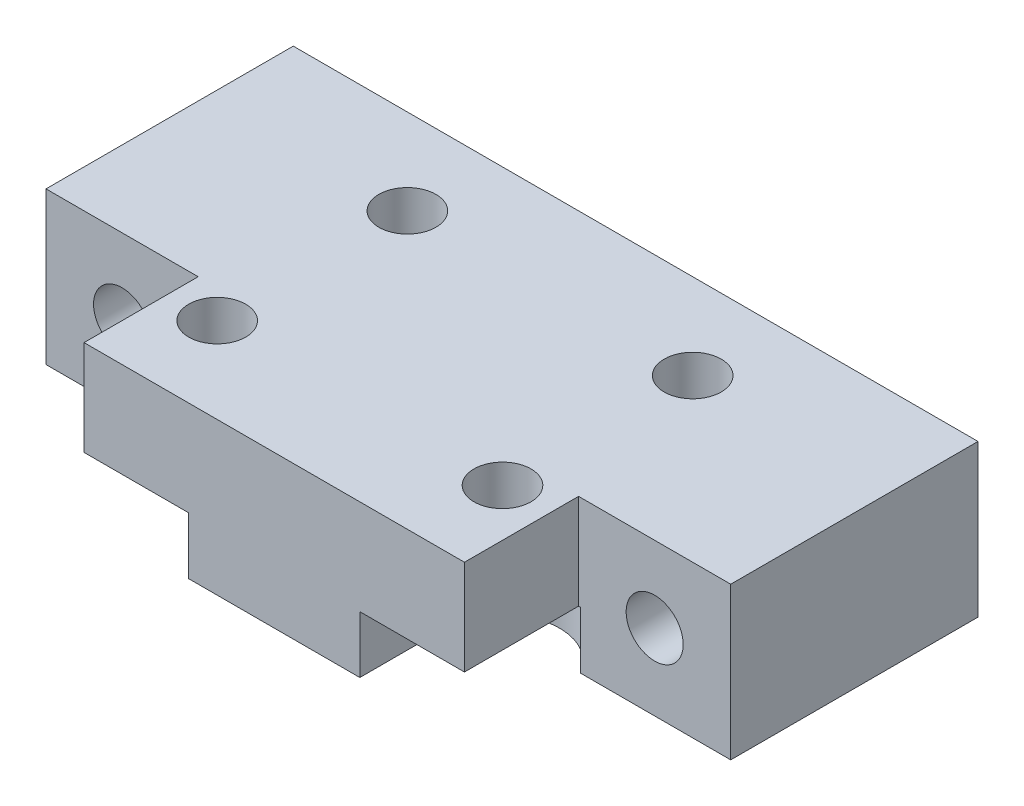
ISO-10303-21;
HEADER;
FILE_DESCRIPTION(('STEP AP214'),'2;1');
FILE_NAME('part.step','',(''),(''),'','','');
FILE_SCHEMA(('AUTOMOTIVE_DESIGN { 1 0 10303 214 1 1 1 1 }'));
ENDSEC;
DATA;
#1=APPLICATION_CONTEXT('core data for automotive mechanical design processes');
#2=APPLICATION_PROTOCOL_DEFINITION('international standard','automotive_design',2000,#1);
#3=PRODUCT_CONTEXT('',#1,'mechanical');
#4=PRODUCT('Part','Part','',(#3));
#5=PRODUCT_RELATED_PRODUCT_CATEGORY('part','',(#4));
#6=PRODUCT_DEFINITION_FORMATION('','',#4);
#7=PRODUCT_DEFINITION_CONTEXT('part definition',#1,'design');
#8=PRODUCT_DEFINITION('design','',#6,#7);
#9=PRODUCT_DEFINITION_SHAPE('','',#8);
#10=(LENGTH_UNIT() NAMED_UNIT(*) SI_UNIT(.MILLI.,.METRE.));
#11=(NAMED_UNIT(*) PLANE_ANGLE_UNIT() SI_UNIT($,.RADIAN.));
#12=(NAMED_UNIT(*) SI_UNIT($,.STERADIAN.) SOLID_ANGLE_UNIT());
#13=UNCERTAINTY_MEASURE_WITH_UNIT(LENGTH_MEASURE(1.E-05),#10,'distance_accuracy_value','');
#14=(GEOMETRIC_REPRESENTATION_CONTEXT(3) GLOBAL_UNCERTAINTY_ASSIGNED_CONTEXT((#13)) GLOBAL_UNIT_ASSIGNED_CONTEXT((#10,
#11,#12)) REPRESENTATION_CONTEXT('',''));
#15=CARTESIAN_POINT('',(0.,0.,0.));
#16=DIRECTION('',(0.,0.,1.));
#17=DIRECTION('',(1.,0.,0.));
#18=AXIS2_PLACEMENT_3D('',#15,#16,#17);
#19=CARTESIAN_POINT('',(0.,0.,0.));
#20=DIRECTION('',(0.,1.,0.));
#21=DIRECTION('',(0.,0.,1.));
#22=AXIS2_PLACEMENT_3D('',#19,#20,#21);
#23=PLANE('',#22);
#24=CARTESIAN_POINT('',(7.5,0.,-14.5));
#25=DIRECTION('',(0.,-1.,0.));
#26=DIRECTION('',(0.,0.,-1.));
#27=AXIS2_PLACEMENT_3D('',#24,#25,#26);
#28=CIRCLE('',#27,3.);
#29=CARTESIAN_POINT('',(7.5,0.,-17.5));
#30=VERTEX_POINT('',#29);
#31=EDGE_CURVE('E387',#30,#30,#28,.T.);
#32=ORIENTED_EDGE('',*,*,#31,.F.);
#33=EDGE_LOOP('',(#32));
#34=FACE_BOUND('',#33,.T.);
#35=CARTESIAN_POINT('',(-7.5,0.,-14.5));
#36=DIRECTION('',(0.,-1.,0.));
#37=DIRECTION('',(0.,0.,-1.));
#38=AXIS2_PLACEMENT_3D('',#35,#36,#37);
#39=CIRCLE('',#38,3.);
#40=CARTESIAN_POINT('',(-7.5,0.,-17.5));
#41=VERTEX_POINT('',#40);
#42=EDGE_CURVE('E388',#41,#41,#39,.T.);
#43=ORIENTED_EDGE('',*,*,#42,.F.);
#44=EDGE_LOOP('',(#43));
#45=FACE_BOUND('',#44,.T.);
#46=CARTESIAN_POINT('',(7.5,0.,-4.5));
#47=DIRECTION('',(0.,-1.,0.));
#48=DIRECTION('',(0.,0.,-1.));
#49=AXIS2_PLACEMENT_3D('',#46,#47,#48);
#50=CIRCLE('',#49,3.);
#51=CARTESIAN_POINT('',(10.0980762113533,0.,-5.99999999999999));
#52=VERTEX_POINT('',#51);
#53=CARTESIAN_POINT('',(4.5,0.,-4.5));
#54=VERTEX_POINT('',#53);
#55=EDGE_CURVE('E350',#52,#54,#50,.F.);
#56=ORIENTED_EDGE('',*,*,#55,.T.);
#57=DIRECTION('',(0.,0.,1.));
#58=VECTOR('',#57,1.);
#59=CARTESIAN_POINT('',(4.5,0.,0.));
#60=LINE('',#59,#58);
#61=CARTESIAN_POINT('',(4.5,0.,0.));
#62=VERTEX_POINT('',#61);
#63=EDGE_CURVE('E344',#54,#62,#60,.T.);
#64=ORIENTED_EDGE('',*,*,#63,.T.);
#65=DIRECTION('',(1.,0.,0.));
#66=VECTOR('',#65,1.);
#67=CARTESIAN_POINT('',(-10.,0.,0.));
#68=LINE('',#67,#66);
#69=CARTESIAN_POINT('',(-4.5,0.,0.));
#70=VERTEX_POINT('',#69);
#71=EDGE_CURVE('E289',#70,#62,#68,.T.);
#72=ORIENTED_EDGE('',*,*,#71,.F.);
#73=DIRECTION('',(0.,0.,1.));
#74=VECTOR('',#73,1.);
#75=CARTESIAN_POINT('',(-4.5,0.,0.));
#76=LINE('',#75,#74);
#77=CARTESIAN_POINT('',(-4.5,0.,-4.5));
#78=VERTEX_POINT('',#77);
#79=EDGE_CURVE('E76',#78,#70,#76,.T.);
#80=ORIENTED_EDGE('',*,*,#79,.F.);
#81=CARTESIAN_POINT('',(-7.5,0.,-4.5));
#82=DIRECTION('',(0.,-1.,0.));
#83=DIRECTION('',(0.,0.,-1.));
#84=AXIS2_PLACEMENT_3D('',#81,#82,#83);
#85=CIRCLE('',#84,3.);
#86=CARTESIAN_POINT('',(-10.0980762113533,0.,-5.99999999999999));
#87=VERTEX_POINT('',#86);
#88=EDGE_CURVE('E346',#87,#78,#85,.T.);
#89=ORIENTED_EDGE('',*,*,#88,.F.);
#90=DIRECTION('',(1.,0.,0.));
#91=VECTOR('',#90,1.);
#92=CARTESIAN_POINT('',(-18.,0.,-6.));
#93=LINE('',#92,#91);
#94=CARTESIAN_POINT('',(-18.,0.,-6.));
#95=VERTEX_POINT('',#94);
#96=EDGE_CURVE('E283',#95,#87,#93,.T.);
#97=ORIENTED_EDGE('',*,*,#96,.F.);
#98=DIRECTION('',(0.,0.,1.));
#99=VECTOR('',#98,1.);
#100=CARTESIAN_POINT('',(-18.,0.,-19.));
#101=LINE('',#100,#99);
#102=CARTESIAN_POINT('',(-18.,0.,-19.));
#103=VERTEX_POINT('',#102);
#104=EDGE_CURVE('E260',#103,#95,#101,.T.);
#105=ORIENTED_EDGE('',*,*,#104,.F.);
#106=DIRECTION('',(-1.,0.,0.));
#107=VECTOR('',#106,1.);
#108=CARTESIAN_POINT('',(-18.,0.,-19.));
#109=LINE('',#108,#107);
#110=CARTESIAN_POINT('',(18.,0.,-19.));
#111=VERTEX_POINT('',#110);
#112=EDGE_CURVE('E263',#111,#103,#109,.T.);
#113=ORIENTED_EDGE('',*,*,#112,.F.);
#114=DIRECTION('',(0.,0.,-1.));
#115=VECTOR('',#114,1.);
#116=CARTESIAN_POINT('',(18.,0.,-19.));
#117=LINE('',#116,#115);
#118=CARTESIAN_POINT('',(18.,0.,-6.));
#119=VERTEX_POINT('',#118);
#120=EDGE_CURVE('E293',#119,#111,#117,.T.);
#121=ORIENTED_EDGE('',*,*,#120,.F.);
#122=DIRECTION('',(1.,0.,0.));
#123=VECTOR('',#122,1.);
#124=CARTESIAN_POINT('',(18.,0.,-6.));
#125=LINE('',#124,#123);
#126=EDGE_CURVE('E295',#52,#119,#125,.T.);
#127=ORIENTED_EDGE('',*,*,#126,.F.);
#128=EDGE_LOOP('',(#56,#64,#72,#80,#89,#97,#105,#113,#121,#127));
#129=FACE_BOUND('',#128,.T.);
#130=ADVANCED_FACE('F62',(#34,#45,#129),#23,.F.);
#131=CARTESIAN_POINT('',(-10.,8.,-5.99999999999999));
#132=DIRECTION('',(1.,0.,0.));
#133=DIRECTION('',(0.,0.,-1.));
#134=AXIS2_PLACEMENT_3D('',#131,#132,#133);
#135=PLANE('',#134);
#136=DIRECTION('',(0.,0.,-1.));
#137=VECTOR('',#136,1.);
#138=CARTESIAN_POINT('',(-10.,3.,-5.99999999999999));
#139=LINE('',#138,#137);
#140=CARTESIAN_POINT('',(-10.,3.,0.));
#141=VERTEX_POINT('',#140);
#142=CARTESIAN_POINT('',(-10.,3.,-5.99999999999999));
#143=VERTEX_POINT('',#142);
#144=EDGE_CURVE('E380',#141,#143,#139,.T.);
#145=ORIENTED_EDGE('',*,*,#144,.F.);
#146=DIRECTION('',(0.,-1.,0.));
#147=VECTOR('',#146,1.);
#148=CARTESIAN_POINT('',(-10.,8.,0.));
#149=LINE('',#148,#147);
#150=CARTESIAN_POINT('',(-10.,8.,0.));
#151=VERTEX_POINT('',#150);
#152=EDGE_CURVE('E193',#151,#141,#149,.T.);
#153=ORIENTED_EDGE('',*,*,#152,.F.);
#154=DIRECTION('',(0.,0.,1.));
#155=VECTOR('',#154,1.);
#156=CARTESIAN_POINT('',(-10.,8.,-5.99999999999999));
#157=LINE('',#156,#155);
#158=CARTESIAN_POINT('',(-10.,8.,-5.99999999999999));
#159=VERTEX_POINT('',#158);
#160=EDGE_CURVE('E266',#159,#151,#157,.T.);
#161=ORIENTED_EDGE('',*,*,#160,.F.);
#162=DIRECTION('',(0.,-1.,0.));
#163=VECTOR('',#162,1.);
#164=CARTESIAN_POINT('',(-10.,8.,-5.99999999999999));
#165=LINE('',#164,#163);
#166=EDGE_CURVE('E72',#159,#143,#165,.T.);
#167=ORIENTED_EDGE('',*,*,#166,.T.);
#168=EDGE_LOOP('',(#145,#153,#161,#167));
#169=FACE_BOUND('',#168,.T.);
#170=ADVANCED_FACE('F403',(#169),#135,.F.);
#171=CARTESIAN_POINT('',(-10.,8.,0.));
#172=DIRECTION('',(0.,0.,-1.));
#173=DIRECTION('',(-1.,0.,0.));
#174=AXIS2_PLACEMENT_3D('',#171,#172,#173);
#175=PLANE('',#174);
#176=DIRECTION('',(0.,-1.,0.));
#177=VECTOR('',#176,1.);
#178=CARTESIAN_POINT('',(4.5,3.,0.));
#179=LINE('',#178,#177);
#180=CARTESIAN_POINT('',(4.5,3.,0.));
#181=VERTEX_POINT('',#180);
#182=EDGE_CURVE('E187',#181,#62,#179,.T.);
#183=ORIENTED_EDGE('',*,*,#182,.F.);
#184=DIRECTION('',(-1.,0.,0.));
#185=VECTOR('',#184,1.);
#186=CARTESIAN_POINT('',(0.,3.,0.));
#187=LINE('',#186,#185);
#188=CARTESIAN_POINT('',(10.,3.,0.));
#189=VERTEX_POINT('',#188);
#190=EDGE_CURVE('E169',#189,#181,#187,.T.);
#191=ORIENTED_EDGE('',*,*,#190,.F.);
#192=DIRECTION('',(0.,-1.,0.));
#193=VECTOR('',#192,1.);
#194=CARTESIAN_POINT('',(10.,8.,0.));
#195=LINE('',#194,#193);
#196=CARTESIAN_POINT('',(10.,8.,0.));
#197=VERTEX_POINT('',#196);
#198=EDGE_CURVE('E181',#197,#189,#195,.T.);
#199=ORIENTED_EDGE('',*,*,#198,.F.);
#200=DIRECTION('',(1.,0.,0.));
#201=VECTOR('',#200,1.);
#202=CARTESIAN_POINT('',(-10.,8.,0.));
#203=LINE('',#202,#201);
#204=EDGE_CURVE('E267',#151,#197,#203,.T.);
#205=ORIENTED_EDGE('',*,*,#204,.F.);
#206=ORIENTED_EDGE('',*,*,#152,.T.);
#207=DIRECTION('',(-1.,0.,0.));
#208=VECTOR('',#207,1.);
#209=CARTESIAN_POINT('',(0.,3.,0.));
#210=LINE('',#209,#208);
#211=CARTESIAN_POINT('',(-4.5,3.,0.));
#212=VERTEX_POINT('',#211);
#213=EDGE_CURVE('E365',#212,#141,#210,.T.);
#214=ORIENTED_EDGE('',*,*,#213,.F.);
#215=DIRECTION('',(0.,-1.,0.));
#216=VECTOR('',#215,1.);
#217=CARTESIAN_POINT('',(-4.5,3.,0.));
#218=LINE('',#217,#216);
#219=EDGE_CURVE('E364',#212,#70,#218,.T.);
#220=ORIENTED_EDGE('',*,*,#219,.T.);
#221=ORIENTED_EDGE('',*,*,#71,.T.);
#222=EDGE_LOOP('',(#183,#191,#199,#205,#206,#214,#220,#221));
#223=FACE_BOUND('',#222,.T.);
#224=ADVANCED_FACE('F182',(#223),#175,.F.);
#225=CARTESIAN_POINT('',(10.,8.,-5.99999999999999));
#226=DIRECTION('',(-1.,0.,0.));
#227=DIRECTION('',(0.,0.,1.));
#228=AXIS2_PLACEMENT_3D('',#225,#226,#227);
#229=PLANE('',#228);
#230=DIRECTION('',(0.,0.,1.));
#231=VECTOR('',#230,1.);
#232=CARTESIAN_POINT('',(10.,3.,0.));
#233=LINE('',#232,#231);
#234=CARTESIAN_POINT('',(10.,3.,-5.99999999999999));
#235=VERTEX_POINT('',#234);
#236=EDGE_CURVE('E164',#235,#189,#233,.T.);
#237=ORIENTED_EDGE('',*,*,#236,.F.);
#238=DIRECTION('',(0.,-1.,0.));
#239=VECTOR('',#238,1.);
#240=CARTESIAN_POINT('',(10.,8.,-5.99999999999999));
#241=LINE('',#240,#239);
#242=CARTESIAN_POINT('',(10.,8.,-5.99999999999999));
#243=VERTEX_POINT('',#242);
#244=EDGE_CURVE('E194',#243,#235,#241,.T.);
#245=ORIENTED_EDGE('',*,*,#244,.F.);
#246=DIRECTION('',(0.,0.,-1.));
#247=VECTOR('',#246,1.);
#248=CARTESIAN_POINT('',(10.,8.,-5.99999999999999));
#249=LINE('',#248,#247);
#250=EDGE_CURVE('E192',#197,#243,#249,.T.);
#251=ORIENTED_EDGE('',*,*,#250,.F.);
#252=ORIENTED_EDGE('',*,*,#198,.T.);
#253=EDGE_LOOP('',(#237,#245,#251,#252));
#254=FACE_BOUND('',#253,.T.);
#255=ADVANCED_FACE('F188',(#254),#229,.F.);
#256=CARTESIAN_POINT('',(18.,8.,-6.));
#257=DIRECTION('',(0.,0.,-1.));
#258=DIRECTION('',(-1.,0.,0.));
#259=AXIS2_PLACEMENT_3D('',#256,#257,#258);
#260=PLANE('',#259);
#261=CARTESIAN_POINT('',(14.,4.,-6.));
#262=DIRECTION('',(0.,0.,-1.));
#263=DIRECTION('',(-1.,0.,0.));
#264=AXIS2_PLACEMENT_3D('',#261,#262,#263);
#265=CIRCLE('',#264,1.5);
#266=CARTESIAN_POINT('',(12.5,4.,-6.));
#267=VERTEX_POINT('',#266);
#268=EDGE_CURVE('E240',#267,#267,#265,.T.);
#269=ORIENTED_EDGE('',*,*,#268,.T.);
#270=EDGE_LOOP('',(#269));
#271=FACE_BOUND('',#270,.T.);
#272=DIRECTION('',(0.,-1.,0.));
#273=VECTOR('',#272,1.);
#274=CARTESIAN_POINT('',(10.0980762113533,3.,-5.99999999999999));
#275=LINE('',#274,#273);
#276=CARTESIAN_POINT('',(10.0980762113533,3.,-5.99999999999999));
#277=VERTEX_POINT('',#276);
#278=EDGE_CURVE('E331',#277,#52,#275,.T.);
#279=ORIENTED_EDGE('',*,*,#278,.T.);
#280=ORIENTED_EDGE('',*,*,#126,.T.);
#281=DIRECTION('',(0.,-1.,0.));
#282=VECTOR('',#281,1.);
#283=CARTESIAN_POINT('',(18.,8.,-6.));
#284=LINE('',#283,#282);
#285=CARTESIAN_POINT('',(18.,8.,-6.));
#286=VERTEX_POINT('',#285);
#287=EDGE_CURVE('E205',#286,#119,#284,.T.);
#288=ORIENTED_EDGE('',*,*,#287,.F.);
#289=DIRECTION('',(1.,0.,0.));
#290=VECTOR('',#289,1.);
#291=CARTESIAN_POINT('',(18.,8.,-6.));
#292=LINE('',#291,#290);
#293=EDGE_CURVE('E272',#243,#286,#292,.T.);
#294=ORIENTED_EDGE('',*,*,#293,.F.);
#295=ORIENTED_EDGE('',*,*,#244,.T.);
#296=DIRECTION('',(-1.,0.,0.));
#297=VECTOR('',#296,1.);
#298=CARTESIAN_POINT('',(0.,3.,-5.99999999999999));
#299=LINE('',#298,#297);
#300=EDGE_CURVE('E172',#277,#235,#299,.T.);
#301=ORIENTED_EDGE('',*,*,#300,.F.);
#302=EDGE_LOOP('',(#279,#280,#288,#294,#295,#301));
#303=FACE_BOUND('',#302,.T.);
#304=ADVANCED_FACE('F334',(#271,#303),#260,.F.);
#305=CARTESIAN_POINT('',(7.5,8.,-4.5));
#306=DIRECTION('',(0.,-1.,0.));
#307=DIRECTION('',(0.,0.,-1.));
#308=AXIS2_PLACEMENT_3D('',#305,#306,#307);
#309=CYLINDRICAL_SURFACE('',#308,1.5);
#310=CARTESIAN_POINT('',(7.5,8.,-4.5));
#311=DIRECTION('',(0.,1.,0.));
#312=DIRECTION('',(0.,0.,-1.));
#313=AXIS2_PLACEMENT_3D('',#310,#311,#312);
#314=CIRCLE('',#313,1.5);
#315=CARTESIAN_POINT('',(7.5,8.,-6.));
#316=VERTEX_POINT('',#315);
#317=EDGE_CURVE('E249',#316,#316,#314,.T.);
#318=ORIENTED_EDGE('',*,*,#317,.T.);
#319=EDGE_LOOP('',(#318));
#320=FACE_BOUND('',#319,.T.);
#321=CARTESIAN_POINT('',(7.5,3.,-4.5));
#322=DIRECTION('',(0.,-1.,0.));
#323=DIRECTION('',(0.,0.,-1.));
#324=AXIS2_PLACEMENT_3D('',#321,#322,#323);
#325=CIRCLE('',#324,1.5);
#326=CARTESIAN_POINT('',(7.5,3.,-6.));
#327=VERTEX_POINT('',#326);
#328=EDGE_CURVE('E180',#327,#327,#325,.F.);
#329=ORIENTED_EDGE('',*,*,#328,.F.);
#330=EDGE_LOOP('',(#329));
#331=FACE_BOUND('',#330,.T.);
#332=ADVANCED_FACE('F441',(#320,#331),#309,.F.);
#333=CARTESIAN_POINT('',(-7.5,8.,-4.5));
#334=DIRECTION('',(0.,-1.,0.));
#335=DIRECTION('',(0.,0.,-1.));
#336=AXIS2_PLACEMENT_3D('',#333,#334,#335);
#337=CYLINDRICAL_SURFACE('',#336,1.5);
#338=CARTESIAN_POINT('',(-7.5,8.,-4.5));
#339=DIRECTION('',(0.,1.,0.));
#340=DIRECTION('',(0.,0.,1.));
#341=AXIS2_PLACEMENT_3D('',#338,#339,#340);
#342=CIRCLE('',#341,1.5);
#343=CARTESIAN_POINT('',(-7.5,8.,-3.));
#344=VERTEX_POINT('',#343);
#345=EDGE_CURVE('E243',#344,#344,#342,.T.);
#346=ORIENTED_EDGE('',*,*,#345,.T.);
#347=EDGE_LOOP('',(#346));
#348=FACE_BOUND('',#347,.T.);
#349=CARTESIAN_POINT('',(-7.5,3.,-4.5));
#350=DIRECTION('',(0.,-1.,0.));
#351=DIRECTION('',(0.,0.,-1.));
#352=AXIS2_PLACEMENT_3D('',#349,#350,#351);
#353=CIRCLE('',#352,1.5);
#354=CARTESIAN_POINT('',(-7.5,3.,-6.));
#355=VERTEX_POINT('',#354);
#356=EDGE_CURVE('E63',#355,#355,#353,.T.);
#357=ORIENTED_EDGE('',*,*,#356,.T.);
#358=EDGE_LOOP('',(#357));
#359=FACE_BOUND('',#358,.T.);
#360=ADVANCED_FACE('F442',(#348,#359),#337,.F.);
#361=CARTESIAN_POINT('',(7.5,8.,-14.5));
#362=DIRECTION('',(0.,-1.,0.));
#363=DIRECTION('',(0.,0.,-1.));
#364=AXIS2_PLACEMENT_3D('',#361,#362,#363);
#365=CYLINDRICAL_SURFACE('',#364,1.5);
#366=CARTESIAN_POINT('',(7.5,8.,-14.5));
#367=DIRECTION('',(0.,1.,0.));
#368=DIRECTION('',(0.,0.,1.));
#369=AXIS2_PLACEMENT_3D('',#366,#367,#368);
#370=CIRCLE('',#369,1.5);
#371=CARTESIAN_POINT('',(7.5,8.,-13.));
#372=VERTEX_POINT('',#371);
#373=EDGE_CURVE('E251',#372,#372,#370,.T.);
#374=ORIENTED_EDGE('',*,*,#373,.T.);
#375=EDGE_LOOP('',(#374));
#376=FACE_BOUND('',#375,.T.);
#377=CARTESIAN_POINT('',(7.5,3.,-14.5));
#378=DIRECTION('',(0.,-1.,0.));
#379=DIRECTION('',(0.,0.,-1.));
#380=AXIS2_PLACEMENT_3D('',#377,#378,#379);
#381=CIRCLE('',#380,1.5);
#382=CARTESIAN_POINT('',(7.5,3.,-16.));
#383=VERTEX_POINT('',#382);
#384=EDGE_CURVE('E215',#383,#383,#381,.T.);
#385=ORIENTED_EDGE('',*,*,#384,.T.);
#386=EDGE_LOOP('',(#385));
#387=FACE_BOUND('',#386,.T.);
#388=ADVANCED_FACE('F438',(#376,#387),#365,.F.);
#389=CARTESIAN_POINT('',(-7.5,8.,-14.5));
#390=DIRECTION('',(0.,-1.,0.));
#391=DIRECTION('',(0.,0.,-1.));
#392=AXIS2_PLACEMENT_3D('',#389,#390,#391);
#393=CYLINDRICAL_SURFACE('',#392,1.5);
#394=CARTESIAN_POINT('',(-7.5,8.,-14.5));
#395=DIRECTION('',(0.,1.,0.));
#396=DIRECTION('',(0.,0.,-1.));
#397=AXIS2_PLACEMENT_3D('',#394,#395,#396);
#398=CIRCLE('',#397,1.5);
#399=CARTESIAN_POINT('',(-7.5,8.,-16.));
#400=VERTEX_POINT('',#399);
#401=EDGE_CURVE('E242',#400,#400,#398,.T.);
#402=ORIENTED_EDGE('',*,*,#401,.T.);
#403=EDGE_LOOP('',(#402));
#404=FACE_BOUND('',#403,.T.);
#405=CARTESIAN_POINT('',(-7.5,3.,-14.5));
#406=DIRECTION('',(0.,-1.,0.));
#407=DIRECTION('',(0.,0.,-1.));
#408=AXIS2_PLACEMENT_3D('',#405,#406,#407);
#409=CIRCLE('',#408,1.5);
#410=CARTESIAN_POINT('',(-7.5,3.,-16.));
#411=VERTEX_POINT('',#410);
#412=EDGE_CURVE('E207',#411,#411,#409,.T.);
#413=ORIENTED_EDGE('',*,*,#412,.T.);
#414=EDGE_LOOP('',(#413));
#415=FACE_BOUND('',#414,.T.);
#416=ADVANCED_FACE('F436',(#404,#415),#393,.F.);
#417=CARTESIAN_POINT('',(0.,8.,0.));
#418=DIRECTION('',(0.,1.,0.));
#419=DIRECTION('',(0.,0.,1.));
#420=AXIS2_PLACEMENT_3D('',#417,#418,#419);
#421=PLANE('',#420);
#422=ORIENTED_EDGE('',*,*,#345,.F.);
#423=EDGE_LOOP('',(#422));
#424=FACE_BOUND('',#423,.T.);
#425=ORIENTED_EDGE('',*,*,#373,.F.);
#426=EDGE_LOOP('',(#425));
#427=FACE_BOUND('',#426,.T.);
#428=DIRECTION('',(0.,0.,1.));
#429=VECTOR('',#428,1.);
#430=CARTESIAN_POINT('',(-18.,8.,-19.));
#431=LINE('',#430,#429);
#432=CARTESIAN_POINT('',(-18.,8.,-19.));
#433=VERTEX_POINT('',#432);
#434=CARTESIAN_POINT('',(-18.,8.,-6.));
#435=VERTEX_POINT('',#434);
#436=EDGE_CURVE('E256',#433,#435,#431,.T.);
#437=ORIENTED_EDGE('',*,*,#436,.T.);
#438=DIRECTION('',(1.,0.,0.));
#439=VECTOR('',#438,1.);
#440=CARTESIAN_POINT('',(-18.,8.,-6.));
#441=LINE('',#440,#439);
#442=EDGE_CURVE('E265',#435,#159,#441,.T.);
#443=ORIENTED_EDGE('',*,*,#442,.T.);
#444=ORIENTED_EDGE('',*,*,#160,.T.);
#445=ORIENTED_EDGE('',*,*,#204,.T.);
#446=ORIENTED_EDGE('',*,*,#250,.T.);
#447=ORIENTED_EDGE('',*,*,#293,.T.);
#448=DIRECTION('',(0.,0.,-1.));
#449=VECTOR('',#448,1.);
#450=CARTESIAN_POINT('',(18.,8.,-19.));
#451=LINE('',#450,#449);
#452=CARTESIAN_POINT('',(18.,8.,-19.));
#453=VERTEX_POINT('',#452);
#454=EDGE_CURVE('E274',#286,#453,#451,.T.);
#455=ORIENTED_EDGE('',*,*,#454,.T.);
#456=DIRECTION('',(-1.,0.,0.));
#457=VECTOR('',#456,1.);
#458=CARTESIAN_POINT('',(-18.,8.,-19.));
#459=LINE('',#458,#457);
#460=EDGE_CURVE('E279',#453,#433,#459,.T.);
#461=ORIENTED_EDGE('',*,*,#460,.T.);
#462=EDGE_LOOP('',(#437,#443,#444,#445,#446,#447,#455,#461));
#463=FACE_BOUND('',#462,.T.);
#464=ORIENTED_EDGE('',*,*,#317,.F.);
#465=EDGE_LOOP('',(#464));
#466=FACE_BOUND('',#465,.T.);
#467=ORIENTED_EDGE('',*,*,#401,.F.);
#468=EDGE_LOOP('',(#467));
#469=FACE_BOUND('',#468,.T.);
#470=ADVANCED_FACE('F328',(#424,#427,#463,#466,#469),#421,.T.);
#471=CARTESIAN_POINT('',(-18.,8.,-19.));
#472=DIRECTION('',(1.,0.,0.));
#473=DIRECTION('',(0.,0.,-1.));
#474=AXIS2_PLACEMENT_3D('',#471,#472,#473);
#475=PLANE('',#474);
#476=ORIENTED_EDGE('',*,*,#104,.T.);
#477=DIRECTION('',(0.,-1.,0.));
#478=VECTOR('',#477,1.);
#479=CARTESIAN_POINT('',(-18.,8.,-6.));
#480=LINE('',#479,#478);
#481=EDGE_CURVE('E12',#435,#95,#480,.T.);
#482=ORIENTED_EDGE('',*,*,#481,.F.);
#483=ORIENTED_EDGE('',*,*,#436,.F.);
#484=DIRECTION('',(0.,-1.,0.));
#485=VECTOR('',#484,1.);
#486=CARTESIAN_POINT('',(-18.,8.,-19.));
#487=LINE('',#486,#485);
#488=EDGE_CURVE('E282',#433,#103,#487,.T.);
#489=ORIENTED_EDGE('',*,*,#488,.T.);
#490=EDGE_LOOP('',(#476,#482,#483,#489));
#491=FACE_BOUND('',#490,.T.);
#492=ADVANCED_FACE('F65',(#491),#475,.F.);
#493=CARTESIAN_POINT('',(-18.,8.,-6.));
#494=DIRECTION('',(0.,0.,-1.));
#495=DIRECTION('',(-1.,0.,0.));
#496=AXIS2_PLACEMENT_3D('',#493,#494,#495);
#497=PLANE('',#496);
#498=CARTESIAN_POINT('',(-14.,4.,-6.));
#499=DIRECTION('',(0.,0.,-1.));
#500=DIRECTION('',(-1.,0.,0.));
#501=AXIS2_PLACEMENT_3D('',#498,#499,#500);
#502=CIRCLE('',#501,1.5);
#503=CARTESIAN_POINT('',(-15.5,4.,-6.));
#504=VERTEX_POINT('',#503);
#505=EDGE_CURVE('E228',#504,#504,#502,.T.);
#506=ORIENTED_EDGE('',*,*,#505,.T.);
#507=EDGE_LOOP('',(#506));
#508=FACE_BOUND('',#507,.T.);
#509=ORIENTED_EDGE('',*,*,#96,.T.);
#510=DIRECTION('',(0.,-1.,0.));
#511=VECTOR('',#510,1.);
#512=CARTESIAN_POINT('',(-10.0980762113533,3.,-5.99999999999999));
#513=LINE('',#512,#511);
#514=CARTESIAN_POINT('',(-10.0980762113533,3.,-5.99999999999999));
#515=VERTEX_POINT('',#514);
#516=EDGE_CURVE('E385',#87,#515,#513,.F.);
#517=ORIENTED_EDGE('',*,*,#516,.T.);
#518=DIRECTION('',(-1.,0.,0.));
#519=VECTOR('',#518,1.);
#520=CARTESIAN_POINT('',(-18.,3.,-6.));
#521=LINE('',#520,#519);
#522=EDGE_CURVE('E377',#143,#515,#521,.T.);
#523=ORIENTED_EDGE('',*,*,#522,.F.);
#524=ORIENTED_EDGE('',*,*,#166,.F.);
#525=ORIENTED_EDGE('',*,*,#442,.F.);
#526=ORIENTED_EDGE('',*,*,#481,.T.);
#527=EDGE_LOOP('',(#509,#517,#523,#524,#525,#526));
#528=FACE_BOUND('',#527,.T.);
#529=ADVANCED_FACE('F458',(#508,#528),#497,.F.);
#530=CARTESIAN_POINT('',(18.,8.,-19.));
#531=DIRECTION('',(-1.,0.,0.));
#532=DIRECTION('',(0.,0.,1.));
#533=AXIS2_PLACEMENT_3D('',#530,#531,#532);
#534=PLANE('',#533);
#535=ORIENTED_EDGE('',*,*,#120,.T.);
#536=DIRECTION('',(0.,-1.,0.));
#537=VECTOR('',#536,1.);
#538=CARTESIAN_POINT('',(18.,8.,-19.));
#539=LINE('',#538,#537);
#540=EDGE_CURVE('E305',#453,#111,#539,.T.);
#541=ORIENTED_EDGE('',*,*,#540,.F.);
#542=ORIENTED_EDGE('',*,*,#454,.F.);
#543=ORIENTED_EDGE('',*,*,#287,.T.);
#544=EDGE_LOOP('',(#535,#541,#542,#543));
#545=FACE_BOUND('',#544,.T.);
#546=ADVANCED_FACE('F315',(#545),#534,.F.);
#547=CARTESIAN_POINT('',(-18.,8.,-19.));
#548=DIRECTION('',(0.,0.,1.));
#549=DIRECTION('',(1.,0.,0.));
#550=AXIS2_PLACEMENT_3D('',#547,#548,#549);
#551=PLANE('',#550);
#552=CARTESIAN_POINT('',(14.,4.,-19.));
#553=DIRECTION('',(0.,0.,-1.));
#554=DIRECTION('',(-1.,0.,0.));
#555=AXIS2_PLACEMENT_3D('',#552,#553,#554);
#556=CIRCLE('',#555,1.5);
#557=CARTESIAN_POINT('',(12.5,4.,-19.));
#558=VERTEX_POINT('',#557);
#559=EDGE_CURVE('E224',#558,#558,#556,.T.);
#560=ORIENTED_EDGE('',*,*,#559,.F.);
#561=EDGE_LOOP('',(#560));
#562=FACE_BOUND('',#561,.T.);
#563=CARTESIAN_POINT('',(-14.,4.,-19.));
#564=DIRECTION('',(0.,0.,-1.));
#565=DIRECTION('',(1.,0.,0.));
#566=AXIS2_PLACEMENT_3D('',#563,#564,#565);
#567=CIRCLE('',#566,1.5);
#568=CARTESIAN_POINT('',(-12.5,4.,-19.));
#569=VERTEX_POINT('',#568);
#570=EDGE_CURVE('E216',#569,#569,#567,.T.);
#571=ORIENTED_EDGE('',*,*,#570,.F.);
#572=EDGE_LOOP('',(#571));
#573=FACE_BOUND('',#572,.T.);
#574=ORIENTED_EDGE('',*,*,#112,.T.);
#575=ORIENTED_EDGE('',*,*,#488,.F.);
#576=ORIENTED_EDGE('',*,*,#460,.F.);
#577=ORIENTED_EDGE('',*,*,#540,.T.);
#578=EDGE_LOOP('',(#574,#575,#576,#577));
#579=FACE_BOUND('',#578,.T.);
#580=ADVANCED_FACE('F323',(#562,#573,#579),#551,.F.);
#581=CARTESIAN_POINT('',(-14.,4.,0.));
#582=DIRECTION('',(0.,0.,-1.));
#583=DIRECTION('',(-1.,0.,0.));
#584=AXIS2_PLACEMENT_3D('',#581,#582,#583);
#585=CYLINDRICAL_SURFACE('',#584,1.5);
#586=ORIENTED_EDGE('',*,*,#570,.T.);
#587=EDGE_LOOP('',(#586));
#588=FACE_BOUND('',#587,.T.);
#589=ORIENTED_EDGE('',*,*,#505,.F.);
#590=EDGE_LOOP('',(#589));
#591=FACE_BOUND('',#590,.T.);
#592=ADVANCED_FACE('F419',(#588,#591),#585,.F.);
#593=CARTESIAN_POINT('',(14.,4.,0.));
#594=DIRECTION('',(0.,0.,-1.));
#595=DIRECTION('',(-1.,0.,0.));
#596=AXIS2_PLACEMENT_3D('',#593,#594,#595);
#597=CYLINDRICAL_SURFACE('',#596,1.5);
#598=ORIENTED_EDGE('',*,*,#559,.T.);
#599=EDGE_LOOP('',(#598));
#600=FACE_BOUND('',#599,.T.);
#601=ORIENTED_EDGE('',*,*,#268,.F.);
#602=EDGE_LOOP('',(#601));
#603=FACE_BOUND('',#602,.T.);
#604=ADVANCED_FACE('F415',(#600,#603),#597,.F.);
#605=CARTESIAN_POINT('',(-7.5,3.,-14.5));
#606=DIRECTION('',(0.,-1.,0.));
#607=DIRECTION('',(0.,0.,-1.));
#608=AXIS2_PLACEMENT_3D('',#605,#606,#607);
#609=CYLINDRICAL_SURFACE('',#608,3.);
#610=CARTESIAN_POINT('',(-7.5,3.,-14.5));
#611=DIRECTION('',(0.,-1.,0.));
#612=DIRECTION('',(0.,0.,-1.));
#613=AXIS2_PLACEMENT_3D('',#610,#611,#612);
#614=CIRCLE('',#613,3.);
#615=CARTESIAN_POINT('',(-7.5,3.,-17.5));
#616=VERTEX_POINT('',#615);
#617=EDGE_CURVE('E213',#616,#616,#614,.T.);
#618=ORIENTED_EDGE('',*,*,#617,.F.);
#619=EDGE_LOOP('',(#618));
#620=FACE_BOUND('',#619,.T.);
#621=ORIENTED_EDGE('',*,*,#42,.T.);
#622=EDGE_LOOP('',(#621));
#623=FACE_BOUND('',#622,.T.);
#624=ADVANCED_FACE('F406',(#620,#623),#609,.F.);
#625=CARTESIAN_POINT('',(-7.5,3.,-14.5));
#626=DIRECTION('',(0.,-1.,0.));
#627=DIRECTION('',(0.,0.,-1.));
#628=AXIS2_PLACEMENT_3D('',#625,#626,#627);
#629=PLANE('',#628);
#630=ORIENTED_EDGE('',*,*,#412,.F.);
#631=EDGE_LOOP('',(#630));
#632=FACE_BOUND('',#631,.T.);
#633=ORIENTED_EDGE('',*,*,#617,.T.);
#634=EDGE_LOOP('',(#633));
#635=FACE_BOUND('',#634,.T.);
#636=ADVANCED_FACE('F412',(#632,#635),#629,.T.);
#637=CARTESIAN_POINT('',(7.5,3.,-14.5));
#638=DIRECTION('',(0.,-1.,0.));
#639=DIRECTION('',(0.,0.,-1.));
#640=AXIS2_PLACEMENT_3D('',#637,#638,#639);
#641=CYLINDRICAL_SURFACE('',#640,3.);
#642=CARTESIAN_POINT('',(7.5,3.,-14.5));
#643=DIRECTION('',(0.,-1.,0.));
#644=DIRECTION('',(0.,0.,-1.));
#645=AXIS2_PLACEMENT_3D('',#642,#643,#644);
#646=CIRCLE('',#645,3.);
#647=CARTESIAN_POINT('',(7.5,3.,-17.5));
#648=VERTEX_POINT('',#647);
#649=EDGE_CURVE('E391',#648,#648,#646,.T.);
#650=ORIENTED_EDGE('',*,*,#649,.F.);
#651=EDGE_LOOP('',(#650));
#652=FACE_BOUND('',#651,.T.);
#653=ORIENTED_EDGE('',*,*,#31,.T.);
#654=EDGE_LOOP('',(#653));
#655=FACE_BOUND('',#654,.T.);
#656=ADVANCED_FACE('F402',(#652,#655),#641,.F.);
#657=CARTESIAN_POINT('',(7.5,3.,-14.5));
#658=DIRECTION('',(0.,-1.,0.));
#659=DIRECTION('',(0.,0.,-1.));
#660=AXIS2_PLACEMENT_3D('',#657,#658,#659);
#661=PLANE('',#660);
#662=ORIENTED_EDGE('',*,*,#384,.F.);
#663=EDGE_LOOP('',(#662));
#664=FACE_BOUND('',#663,.T.);
#665=ORIENTED_EDGE('',*,*,#649,.T.);
#666=EDGE_LOOP('',(#665));
#667=FACE_BOUND('',#666,.T.);
#668=ADVANCED_FACE('F426',(#664,#667),#661,.T.);
#669=CARTESIAN_POINT('',(-7.5,3.,-4.5));
#670=DIRECTION('',(0.,-1.,0.));
#671=DIRECTION('',(0.,0.,-1.));
#672=AXIS2_PLACEMENT_3D('',#669,#670,#671);
#673=CYLINDRICAL_SURFACE('',#672,3.);
#674=ORIENTED_EDGE('',*,*,#88,.T.);
#675=DIRECTION('',(0.,-1.,0.));
#676=VECTOR('',#675,1.);
#677=CARTESIAN_POINT('',(-4.5,3.,-4.5));
#678=LINE('',#677,#676);
#679=CARTESIAN_POINT('',(-4.5,3.,-4.5));
#680=VERTEX_POINT('',#679);
#681=EDGE_CURVE('E363',#680,#78,#678,.T.);
#682=ORIENTED_EDGE('',*,*,#681,.F.);
#683=CARTESIAN_POINT('',(-7.5,3.,-4.5));
#684=DIRECTION('',(0.,-1.,0.));
#685=DIRECTION('',(0.,0.,-1.));
#686=AXIS2_PLACEMENT_3D('',#683,#684,#685);
#687=CIRCLE('',#686,3.);
#688=EDGE_CURVE('E358',#515,#680,#687,.T.);
#689=ORIENTED_EDGE('',*,*,#688,.F.);
#690=ORIENTED_EDGE('',*,*,#516,.F.);
#691=EDGE_LOOP('',(#674,#682,#689,#690));
#692=FACE_BOUND('',#691,.T.);
#693=ADVANCED_FACE('F427',(#692),#673,.F.);
#694=CARTESIAN_POINT('',(0.,3.,0.));
#695=DIRECTION('',(0.,-1.,0.));
#696=DIRECTION('',(0.,0.,-1.));
#697=AXIS2_PLACEMENT_3D('',#694,#695,#696);
#698=PLANE('',#697);
#699=ORIENTED_EDGE('',*,*,#356,.F.);
#700=EDGE_LOOP('',(#699));
#701=FACE_BOUND('',#700,.T.);
#702=ORIENTED_EDGE('',*,*,#522,.T.);
#703=ORIENTED_EDGE('',*,*,#688,.T.);
#704=DIRECTION('',(0.,0.,1.));
#705=VECTOR('',#704,1.);
#706=CARTESIAN_POINT('',(-4.5,3.,0.));
#707=LINE('',#706,#705);
#708=EDGE_CURVE('E367',#680,#212,#707,.T.);
#709=ORIENTED_EDGE('',*,*,#708,.T.);
#710=ORIENTED_EDGE('',*,*,#213,.T.);
#711=ORIENTED_EDGE('',*,*,#144,.T.);
#712=EDGE_LOOP('',(#702,#703,#709,#710,#711));
#713=FACE_BOUND('',#712,.T.);
#714=ADVANCED_FACE('F486',(#701,#713),#698,.T.);
#715=CARTESIAN_POINT('',(-4.5,3.,0.));
#716=DIRECTION('',(1.,0.,0.));
#717=DIRECTION('',(0.,0.,-1.));
#718=AXIS2_PLACEMENT_3D('',#715,#716,#717);
#719=PLANE('',#718);
#720=ORIENTED_EDGE('',*,*,#79,.T.);
#721=ORIENTED_EDGE('',*,*,#219,.F.);
#722=ORIENTED_EDGE('',*,*,#708,.F.);
#723=ORIENTED_EDGE('',*,*,#681,.T.);
#724=EDGE_LOOP('',(#720,#721,#722,#723));
#725=FACE_BOUND('',#724,.T.);
#726=ADVANCED_FACE('F483',(#725),#719,.F.);
#727=CARTESIAN_POINT('',(7.5,3.,-4.5));
#728=DIRECTION('',(0.,-1.,0.));
#729=DIRECTION('',(0.,0.,-1.));
#730=AXIS2_PLACEMENT_3D('',#727,#728,#729);
#731=CYLINDRICAL_SURFACE('',#730,3.);
#732=ORIENTED_EDGE('',*,*,#55,.F.);
#733=ORIENTED_EDGE('',*,*,#278,.F.);
#734=CARTESIAN_POINT('',(7.5,3.,-4.5));
#735=DIRECTION('',(0.,-1.,0.));
#736=DIRECTION('',(0.,0.,-1.));
#737=AXIS2_PLACEMENT_3D('',#734,#735,#736);
#738=CIRCLE('',#737,3.);
#739=CARTESIAN_POINT('',(4.5,3.,-4.5));
#740=VERTEX_POINT('',#739);
#741=EDGE_CURVE('E87',#277,#740,#738,.F.);
#742=ORIENTED_EDGE('',*,*,#741,.T.);
#743=DIRECTION('',(0.,-1.,0.));
#744=VECTOR('',#743,1.);
#745=CARTESIAN_POINT('',(4.5,3.,-4.5));
#746=LINE('',#745,#744);
#747=EDGE_CURVE('E340',#740,#54,#746,.T.);
#748=ORIENTED_EDGE('',*,*,#747,.T.);
#749=EDGE_LOOP('',(#732,#733,#742,#748));
#750=FACE_BOUND('',#749,.T.);
#751=ADVANCED_FACE('F492',(#750),#731,.F.);
#752=CARTESIAN_POINT('',(4.5,3.,0.));
#753=DIRECTION('',(1.,0.,0.));
#754=DIRECTION('',(0.,0.,-1.));
#755=AXIS2_PLACEMENT_3D('',#752,#753,#754);
#756=PLANE('',#755);
#757=ORIENTED_EDGE('',*,*,#63,.F.);
#758=ORIENTED_EDGE('',*,*,#747,.F.);
#759=DIRECTION('',(0.,0.,1.));
#760=VECTOR('',#759,1.);
#761=CARTESIAN_POINT('',(4.5,3.,0.));
#762=LINE('',#761,#760);
#763=EDGE_CURVE('E190',#740,#181,#762,.T.);
#764=ORIENTED_EDGE('',*,*,#763,.T.);
#765=ORIENTED_EDGE('',*,*,#182,.T.);
#766=EDGE_LOOP('',(#757,#758,#764,#765));
#767=FACE_BOUND('',#766,.T.);
#768=ADVANCED_FACE('F491',(#767),#756,.T.);
#769=CARTESIAN_POINT('',(0.,3.,0.));
#770=DIRECTION('',(0.,-1.,0.));
#771=DIRECTION('',(0.,0.,-1.));
#772=AXIS2_PLACEMENT_3D('',#769,#770,#771);
#773=PLANE('',#772);
#774=ORIENTED_EDGE('',*,*,#328,.T.);
#775=EDGE_LOOP('',(#774));
#776=FACE_BOUND('',#775,.T.);
#777=ORIENTED_EDGE('',*,*,#236,.T.);
#778=ORIENTED_EDGE('',*,*,#190,.T.);
#779=ORIENTED_EDGE('',*,*,#763,.F.);
#780=ORIENTED_EDGE('',*,*,#741,.F.);
#781=ORIENTED_EDGE('',*,*,#300,.T.);
#782=EDGE_LOOP('',(#777,#778,#779,#780,#781));
#783=FACE_BOUND('',#782,.T.);
#784=ADVANCED_FACE('F170',(#776,#783),#773,.T.);
#785=CLOSED_SHELL('',(#130,#170,#224,#255,#304,#332,#360,#388,#416,#470,#492,#529,#546,#580,
#592,#604,#624,#636,#656,#668,#693,#714,#726,#751,#768,#784));
#786=MANIFOLD_SOLID_BREP('B2',#785);
#787=ADVANCED_BREP_SHAPE_REPRESENTATION('',(#18,#786),#14);
#788=SHAPE_DEFINITION_REPRESENTATION(#9,#787);
ENDSEC;
END-ISO-10303-21;
